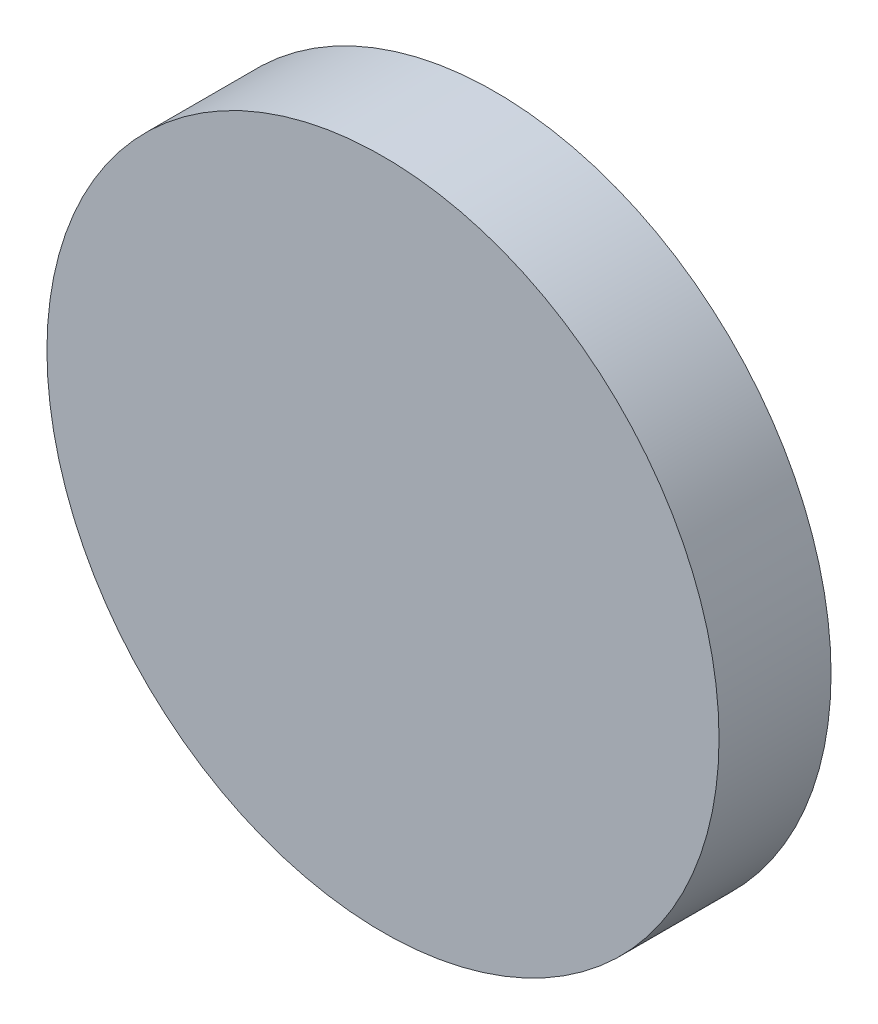
ISO-10303-21;
HEADER;
FILE_DESCRIPTION(('STEP AP214'),'2;1');
FILE_NAME('part.step','',(''),(''),'','','');
FILE_SCHEMA(('AUTOMOTIVE_DESIGN { 1 0 10303 214 1 1 1 1 }'));
ENDSEC;
DATA;
#1=APPLICATION_CONTEXT('core data for automotive mechanical design processes');
#2=APPLICATION_PROTOCOL_DEFINITION('international standard','automotive_design',2000,#1);
#3=PRODUCT_CONTEXT('',#1,'mechanical');
#4=PRODUCT('Part','Part','',(#3));
#5=PRODUCT_RELATED_PRODUCT_CATEGORY('part','',(#4));
#6=PRODUCT_DEFINITION_FORMATION('','',#4);
#7=PRODUCT_DEFINITION_CONTEXT('part definition',#1,'design');
#8=PRODUCT_DEFINITION('design','',#6,#7);
#9=PRODUCT_DEFINITION_SHAPE('','',#8);
#10=(LENGTH_UNIT() NAMED_UNIT(*) SI_UNIT(.MILLI.,.METRE.));
#11=(NAMED_UNIT(*) PLANE_ANGLE_UNIT() SI_UNIT($,.RADIAN.));
#12=(NAMED_UNIT(*) SI_UNIT($,.STERADIAN.) SOLID_ANGLE_UNIT());
#13=UNCERTAINTY_MEASURE_WITH_UNIT(LENGTH_MEASURE(1.E-05),#10,'distance_accuracy_value','');
#14=(GEOMETRIC_REPRESENTATION_CONTEXT(3) GLOBAL_UNCERTAINTY_ASSIGNED_CONTEXT((#13)) GLOBAL_UNIT_ASSIGNED_CONTEXT((#10,
#11,#12)) REPRESENTATION_CONTEXT('',''));
#15=CARTESIAN_POINT('',(0.,0.,0.));
#16=DIRECTION('',(0.,0.,1.));
#17=DIRECTION('',(1.,0.,0.));
#18=AXIS2_PLACEMENT_3D('',#15,#16,#17);
#19=CARTESIAN_POINT('',(0.,0.,7.));
#20=DIRECTION('',(0.,0.,-1.));
#21=DIRECTION('',(-1.,0.,0.));
#22=AXIS2_PLACEMENT_3D('',#19,#20,#21);
#23=CYLINDRICAL_SURFACE('',#22,21.);
#24=CARTESIAN_POINT('',(0.,0.,7.));
#25=DIRECTION('',(0.,0.,1.));
#26=DIRECTION('',(1.,0.,0.));
#27=AXIS2_PLACEMENT_3D('',#24,#25,#26);
#28=CIRCLE('',#27,21.);
#29=CARTESIAN_POINT('',(21.,0.,7.));
#30=VERTEX_POINT('',#29);
#31=EDGE_CURVE('E10',#30,#30,#28,.T.);
#32=ORIENTED_EDGE('',*,*,#31,.F.);
#33=EDGE_LOOP('',(#32));
#34=FACE_BOUND('',#33,.T.);
#35=CARTESIAN_POINT('',(0.,0.,0.));
#36=DIRECTION('',(0.,0.,1.));
#37=DIRECTION('',(1.,0.,0.));
#38=AXIS2_PLACEMENT_3D('',#35,#36,#37);
#39=CIRCLE('',#38,21.);
#40=CARTESIAN_POINT('',(21.,0.,0.));
#41=VERTEX_POINT('',#40);
#42=EDGE_CURVE('E40',#41,#41,#39,.T.);
#43=ORIENTED_EDGE('',*,*,#42,.T.);
#44=EDGE_LOOP('',(#43));
#45=FACE_BOUND('',#44,.T.);
#46=ADVANCED_FACE('F37',(#34,#45),#23,.T.);
#47=CARTESIAN_POINT('',(0.,0.,7.));
#48=DIRECTION('',(0.,0.,1.));
#49=DIRECTION('',(1.,0.,0.));
#50=AXIS2_PLACEMENT_3D('',#47,#48,#49);
#51=PLANE('',#50);
#52=ORIENTED_EDGE('',*,*,#31,.T.);
#53=EDGE_LOOP('',(#52));
#54=FACE_BOUND('',#53,.T.);
#55=ADVANCED_FACE('F54',(#54),#51,.T.);
#56=CARTESIAN_POINT('',(0.,0.,0.));
#57=DIRECTION('',(0.,0.,1.));
#58=DIRECTION('',(1.,0.,0.));
#59=AXIS2_PLACEMENT_3D('',#56,#57,#58);
#60=PLANE('',#59);
#61=ORIENTED_EDGE('',*,*,#42,.F.);
#62=EDGE_LOOP('',(#61));
#63=FACE_BOUND('',#62,.T.);
#64=ADVANCED_FACE('F52',(#63),#60,.F.);
#65=CLOSED_SHELL('',(#46,#55,#64));
#66=MANIFOLD_SOLID_BREP('B2',#65);
#67=ADVANCED_BREP_SHAPE_REPRESENTATION('',(#18,#66),#14);
#68=SHAPE_DEFINITION_REPRESENTATION(#9,#67);
ENDSEC;
END-ISO-10303-21;
